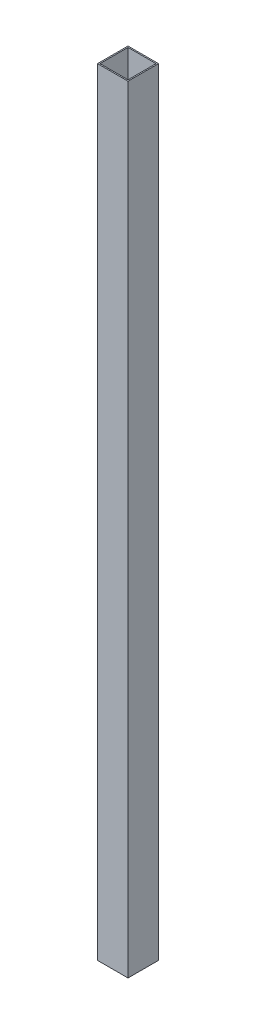
ISO-10303-21;
HEADER;
FILE_DESCRIPTION(('STEP AP214'),'2;1');
FILE_NAME('part.step','',(''),(''),'','','');
FILE_SCHEMA(('AUTOMOTIVE_DESIGN { 1 0 10303 214 1 1 1 1 }'));
ENDSEC;
DATA;
#1=APPLICATION_CONTEXT('core data for automotive mechanical design processes');
#2=APPLICATION_PROTOCOL_DEFINITION('international standard','automotive_design',2000,#1);
#3=PRODUCT_CONTEXT('',#1,'mechanical');
#4=PRODUCT('Part','Part','',(#3));
#5=PRODUCT_RELATED_PRODUCT_CATEGORY('part','',(#4));
#6=PRODUCT_DEFINITION_FORMATION('','',#4);
#7=PRODUCT_DEFINITION_CONTEXT('part definition',#1,'design');
#8=PRODUCT_DEFINITION('design','',#6,#7);
#9=PRODUCT_DEFINITION_SHAPE('','',#8);
#10=(LENGTH_UNIT() NAMED_UNIT(*) SI_UNIT(.MILLI.,.METRE.));
#11=(NAMED_UNIT(*) PLANE_ANGLE_UNIT() SI_UNIT($,.RADIAN.));
#12=(NAMED_UNIT(*) SI_UNIT($,.STERADIAN.) SOLID_ANGLE_UNIT());
#13=UNCERTAINTY_MEASURE_WITH_UNIT(LENGTH_MEASURE(1.E-05),#10,'distance_accuracy_value','');
#14=(GEOMETRIC_REPRESENTATION_CONTEXT(3) GLOBAL_UNCERTAINTY_ASSIGNED_CONTEXT((#13)) GLOBAL_UNIT_ASSIGNED_CONTEXT((#10,
#11,#12)) REPRESENTATION_CONTEXT('',''));
#15=CARTESIAN_POINT('',(0.,0.,0.));
#16=DIRECTION('',(0.,0.,1.));
#17=DIRECTION('',(1.,0.,0.));
#18=AXIS2_PLACEMENT_3D('',#15,#16,#17);
#19=CARTESIAN_POINT('',(-840.,637.,50.));
#20=DIRECTION('',(0.,-1.,0.));
#21=DIRECTION('',(0.,0.,-1.));
#22=AXIS2_PLACEMENT_3D('',#19,#20,#21);
#23=PLANE('',#22);
#24=DIRECTION('',(-1.,0.,0.));
#25=VECTOR('',#24,1.);
#26=CARTESIAN_POINT('',(-815.,637.,48.));
#27=LINE('',#26,#25);
#28=CARTESIAN_POINT('',(-792.,637.,48.));
#29=VERTEX_POINT('',#28);
#30=CARTESIAN_POINT('',(-838.,637.,48.));
#31=VERTEX_POINT('',#30);
#32=EDGE_CURVE('E120',#29,#31,#27,.T.);
#33=ORIENTED_EDGE('',*,*,#32,.T.);
#34=DIRECTION('',(0.,0.,-1.));
#35=VECTOR('',#34,1.);
#36=CARTESIAN_POINT('',(-838.,637.,25.));
#37=LINE('',#36,#35);
#38=CARTESIAN_POINT('',(-838.,637.,2.));
#39=VERTEX_POINT('',#38);
#40=EDGE_CURVE('E123',#31,#39,#37,.T.);
#41=ORIENTED_EDGE('',*,*,#40,.T.);
#42=DIRECTION('',(1.,0.,0.));
#43=VECTOR('',#42,1.);
#44=CARTESIAN_POINT('',(-815.,637.,2.));
#45=LINE('',#44,#43);
#46=CARTESIAN_POINT('',(-792.,637.,2.));
#47=VERTEX_POINT('',#46);
#48=EDGE_CURVE('E110',#39,#47,#45,.T.);
#49=ORIENTED_EDGE('',*,*,#48,.T.);
#50=DIRECTION('',(0.,0.,1.));
#51=VECTOR('',#50,1.);
#52=CARTESIAN_POINT('',(-792.,637.,25.));
#53=LINE('',#52,#51);
#54=EDGE_CURVE('E115',#47,#29,#53,.T.);
#55=ORIENTED_EDGE('',*,*,#54,.T.);
#56=EDGE_LOOP('',(#33,#41,#49,#55));
#57=FACE_BOUND('',#56,.T.);
#58=DIRECTION('',(1.,0.,0.));
#59=VECTOR('',#58,1.);
#60=CARTESIAN_POINT('',(-815.,637.,0.));
#61=LINE('',#60,#59);
#62=CARTESIAN_POINT('',(-840.,637.,0.));
#63=VERTEX_POINT('',#62);
#64=CARTESIAN_POINT('',(-790.,637.,0.));
#65=VERTEX_POINT('',#64);
#66=EDGE_CURVE('E87',#63,#65,#61,.T.);
#67=ORIENTED_EDGE('',*,*,#66,.F.);
#68=DIRECTION('',(0.,0.,1.));
#69=VECTOR('',#68,1.);
#70=CARTESIAN_POINT('',(-840.,637.,25.));
#71=LINE('',#70,#69);
#72=CARTESIAN_POINT('',(-840.,637.,50.));
#73=VERTEX_POINT('',#72);
#74=EDGE_CURVE('E20',#63,#73,#71,.T.);
#75=ORIENTED_EDGE('',*,*,#74,.T.);
#76=DIRECTION('',(1.,0.,0.));
#77=VECTOR('',#76,1.);
#78=CARTESIAN_POINT('',(-815.,637.,50.));
#79=LINE('',#78,#77);
#80=CARTESIAN_POINT('',(-790.,637.,50.));
#81=VERTEX_POINT('',#80);
#82=EDGE_CURVE('E85',#73,#81,#79,.T.);
#83=ORIENTED_EDGE('',*,*,#82,.T.);
#84=DIRECTION('',(0.,0.,1.));
#85=VECTOR('',#84,1.);
#86=CARTESIAN_POINT('',(-790.,637.,25.));
#87=LINE('',#86,#85);
#88=EDGE_CURVE('E79',#65,#81,#87,.T.);
#89=ORIENTED_EDGE('',*,*,#88,.F.);
#90=EDGE_LOOP('',(#67,#75,#83,#89));
#91=FACE_BOUND('',#90,.T.);
#92=ADVANCED_FACE('F16',(#57,#91),#23,.F.);
#93=CARTESIAN_POINT('',(-840.,-637.,50.));
#94=DIRECTION('',(1.,0.,0.));
#95=DIRECTION('',(0.,0.,-1.));
#96=AXIS2_PLACEMENT_3D('',#93,#94,#95);
#97=PLANE('',#96);
#98=DIRECTION('',(0.,0.,1.));
#99=VECTOR('',#98,1.);
#100=CARTESIAN_POINT('',(-840.,-637.,25.));
#101=LINE('',#100,#99);
#102=CARTESIAN_POINT('',(-840.,-637.,0.));
#103=VERTEX_POINT('',#102);
#104=CARTESIAN_POINT('',(-840.,-637.,50.));
#105=VERTEX_POINT('',#104);
#106=EDGE_CURVE('E101',#103,#105,#101,.T.);
#107=ORIENTED_EDGE('',*,*,#106,.T.);
#108=DIRECTION('',(0.,1.,0.));
#109=VECTOR('',#108,1.);
#110=CARTESIAN_POINT('',(-840.,0.,50.));
#111=LINE('',#110,#109);
#112=EDGE_CURVE('E92',#105,#73,#111,.T.);
#113=ORIENTED_EDGE('',*,*,#112,.T.);
#114=ORIENTED_EDGE('',*,*,#74,.F.);
#115=DIRECTION('',(0.,1.,0.));
#116=VECTOR('',#115,1.);
#117=CARTESIAN_POINT('',(-840.,0.,0.));
#118=LINE('',#117,#116);
#119=EDGE_CURVE('E105',#103,#63,#118,.T.);
#120=ORIENTED_EDGE('',*,*,#119,.F.);
#121=EDGE_LOOP('',(#107,#113,#114,#120));
#122=FACE_BOUND('',#121,.T.);
#123=ADVANCED_FACE('F100',(#122),#97,.F.);
#124=CARTESIAN_POINT('',(-790.,-637.,50.));
#125=DIRECTION('',(0.,0.,-1.));
#126=DIRECTION('',(-1.,0.,0.));
#127=AXIS2_PLACEMENT_3D('',#124,#125,#126);
#128=PLANE('',#127);
#129=DIRECTION('',(0.,-1.,0.));
#130=VECTOR('',#129,1.);
#131=CARTESIAN_POINT('',(-790.,0.,50.));
#132=LINE('',#131,#130);
#133=CARTESIAN_POINT('',(-790.,-637.,50.));
#134=VERTEX_POINT('',#133);
#135=EDGE_CURVE('E97',#81,#134,#132,.T.);
#136=ORIENTED_EDGE('',*,*,#135,.F.);
#137=ORIENTED_EDGE('',*,*,#82,.F.);
#138=ORIENTED_EDGE('',*,*,#112,.F.);
#139=DIRECTION('',(1.,0.,0.));
#140=VECTOR('',#139,1.);
#141=CARTESIAN_POINT('',(-815.,-637.,50.));
#142=LINE('',#141,#140);
#143=EDGE_CURVE('E130',#105,#134,#142,.T.);
#144=ORIENTED_EDGE('',*,*,#143,.T.);
#145=EDGE_LOOP('',(#136,#137,#138,#144));
#146=FACE_BOUND('',#145,.T.);
#147=ADVANCED_FACE('F94',(#146),#128,.F.);
#148=CARTESIAN_POINT('',(-790.,-637.,50.));
#149=DIRECTION('',(1.,0.,0.));
#150=DIRECTION('',(0.,0.,-1.));
#151=AXIS2_PLACEMENT_3D('',#148,#149,#150);
#152=PLANE('',#151);
#153=ORIENTED_EDGE('',*,*,#88,.T.);
#154=ORIENTED_EDGE('',*,*,#135,.T.);
#155=DIRECTION('',(0.,0.,-1.));
#156=VECTOR('',#155,1.);
#157=CARTESIAN_POINT('',(-790.,-637.,25.));
#158=LINE('',#157,#156);
#159=CARTESIAN_POINT('',(-790.,-637.,0.));
#160=VERTEX_POINT('',#159);
#161=EDGE_CURVE('E132',#134,#160,#158,.T.);
#162=ORIENTED_EDGE('',*,*,#161,.T.);
#163=DIRECTION('',(0.,-1.,0.));
#164=VECTOR('',#163,1.);
#165=CARTESIAN_POINT('',(-790.,0.,0.));
#166=LINE('',#165,#164);
#167=EDGE_CURVE('E108',#65,#160,#166,.T.);
#168=ORIENTED_EDGE('',*,*,#167,.F.);
#169=EDGE_LOOP('',(#153,#154,#162,#168));
#170=FACE_BOUND('',#169,.T.);
#171=ADVANCED_FACE('F174',(#170),#152,.T.);
#172=CARTESIAN_POINT('',(-790.,-637.,0.));
#173=DIRECTION('',(0.,0.,-1.));
#174=DIRECTION('',(-1.,0.,0.));
#175=AXIS2_PLACEMENT_3D('',#172,#173,#174);
#176=PLANE('',#175);
#177=ORIENTED_EDGE('',*,*,#66,.T.);
#178=ORIENTED_EDGE('',*,*,#167,.T.);
#179=DIRECTION('',(-1.,0.,0.));
#180=VECTOR('',#179,1.);
#181=CARTESIAN_POINT('',(-815.,-637.,0.));
#182=LINE('',#181,#180);
#183=EDGE_CURVE('E135',#160,#103,#182,.T.);
#184=ORIENTED_EDGE('',*,*,#183,.T.);
#185=ORIENTED_EDGE('',*,*,#119,.T.);
#186=EDGE_LOOP('',(#177,#178,#184,#185));
#187=FACE_BOUND('',#186,.T.);
#188=ADVANCED_FACE('F171',(#187),#176,.T.);
#189=CARTESIAN_POINT('',(-792.,-637.,2.));
#190=DIRECTION('',(0.,0.,-1.));
#191=DIRECTION('',(-1.,0.,0.));
#192=AXIS2_PLACEMENT_3D('',#189,#190,#191);
#193=PLANE('',#192);
#194=ORIENTED_EDGE('',*,*,#48,.F.);
#195=DIRECTION('',(0.,-1.,0.));
#196=VECTOR('',#195,1.);
#197=CARTESIAN_POINT('',(-838.,0.,2.));
#198=LINE('',#197,#196);
#199=CARTESIAN_POINT('',(-838.,-637.,2.));
#200=VERTEX_POINT('',#199);
#201=EDGE_CURVE('E126',#39,#200,#198,.T.);
#202=ORIENTED_EDGE('',*,*,#201,.T.);
#203=DIRECTION('',(1.,0.,0.));
#204=VECTOR('',#203,1.);
#205=CARTESIAN_POINT('',(-815.,-637.,2.));
#206=LINE('',#205,#204);
#207=CARTESIAN_POINT('',(-792.,-637.,2.));
#208=VERTEX_POINT('',#207);
#209=EDGE_CURVE('E138',#200,#208,#206,.T.);
#210=ORIENTED_EDGE('',*,*,#209,.T.);
#211=DIRECTION('',(0.,1.,0.));
#212=VECTOR('',#211,1.);
#213=CARTESIAN_POINT('',(-792.,0.,2.));
#214=LINE('',#213,#212);
#215=EDGE_CURVE('E112',#208,#47,#214,.T.);
#216=ORIENTED_EDGE('',*,*,#215,.T.);
#217=EDGE_LOOP('',(#194,#202,#210,#216));
#218=FACE_BOUND('',#217,.T.);
#219=ADVANCED_FACE('F156',(#218),#193,.F.);
#220=CARTESIAN_POINT('',(-792.,-637.,48.));
#221=DIRECTION('',(1.,0.,0.));
#222=DIRECTION('',(0.,0.,-1.));
#223=AXIS2_PLACEMENT_3D('',#220,#221,#222);
#224=PLANE('',#223);
#225=ORIENTED_EDGE('',*,*,#54,.F.);
#226=ORIENTED_EDGE('',*,*,#215,.F.);
#227=DIRECTION('',(0.,0.,1.));
#228=VECTOR('',#227,1.);
#229=CARTESIAN_POINT('',(-792.,-637.,25.));
#230=LINE('',#229,#228);
#231=CARTESIAN_POINT('',(-792.,-637.,48.));
#232=VERTEX_POINT('',#231);
#233=EDGE_CURVE('E141',#208,#232,#230,.T.);
#234=ORIENTED_EDGE('',*,*,#233,.T.);
#235=DIRECTION('',(0.,1.,0.));
#236=VECTOR('',#235,1.);
#237=CARTESIAN_POINT('',(-792.,0.,48.));
#238=LINE('',#237,#236);
#239=EDGE_CURVE('E117',#232,#29,#238,.T.);
#240=ORIENTED_EDGE('',*,*,#239,.T.);
#241=EDGE_LOOP('',(#225,#226,#234,#240));
#242=FACE_BOUND('',#241,.T.);
#243=ADVANCED_FACE('F154',(#242),#224,.F.);
#244=CARTESIAN_POINT('',(-838.,-637.,48.));
#245=DIRECTION('',(0.,0.,1.));
#246=DIRECTION('',(1.,0.,0.));
#247=AXIS2_PLACEMENT_3D('',#244,#245,#246);
#248=PLANE('',#247);
#249=ORIENTED_EDGE('',*,*,#32,.F.);
#250=ORIENTED_EDGE('',*,*,#239,.F.);
#251=DIRECTION('',(-1.,0.,0.));
#252=VECTOR('',#251,1.);
#253=CARTESIAN_POINT('',(-815.,-637.,48.));
#254=LINE('',#253,#252);
#255=CARTESIAN_POINT('',(-838.,-637.,48.));
#256=VERTEX_POINT('',#255);
#257=EDGE_CURVE('E26',#232,#256,#254,.T.);
#258=ORIENTED_EDGE('',*,*,#257,.T.);
#259=DIRECTION('',(0.,1.,0.));
#260=VECTOR('',#259,1.);
#261=CARTESIAN_POINT('',(-838.,0.,48.));
#262=LINE('',#261,#260);
#263=EDGE_CURVE('E34',#256,#31,#262,.T.);
#264=ORIENTED_EDGE('',*,*,#263,.T.);
#265=EDGE_LOOP('',(#249,#250,#258,#264));
#266=FACE_BOUND('',#265,.T.);
#267=ADVANCED_FACE('F148',(#266),#248,.F.);
#268=CARTESIAN_POINT('',(-838.,-637.,2.));
#269=DIRECTION('',(-1.,0.,0.));
#270=DIRECTION('',(0.,0.,1.));
#271=AXIS2_PLACEMENT_3D('',#268,#269,#270);
#272=PLANE('',#271);
#273=ORIENTED_EDGE('',*,*,#40,.F.);
#274=ORIENTED_EDGE('',*,*,#263,.F.);
#275=DIRECTION('',(0.,0.,-1.));
#276=VECTOR('',#275,1.);
#277=CARTESIAN_POINT('',(-838.,-637.,25.));
#278=LINE('',#277,#276);
#279=EDGE_CURVE('E11',#256,#200,#278,.T.);
#280=ORIENTED_EDGE('',*,*,#279,.T.);
#281=ORIENTED_EDGE('',*,*,#201,.F.);
#282=EDGE_LOOP('',(#273,#274,#280,#281));
#283=FACE_BOUND('',#282,.T.);
#284=ADVANCED_FACE('F158',(#283),#272,.F.);
#285=CARTESIAN_POINT('',(-840.,-637.,0.));
#286=DIRECTION('',(0.,1.,0.));
#287=DIRECTION('',(0.,0.,1.));
#288=AXIS2_PLACEMENT_3D('',#285,#286,#287);
#289=PLANE('',#288);
#290=ORIENTED_EDGE('',*,*,#257,.F.);
#291=ORIENTED_EDGE('',*,*,#233,.F.);
#292=ORIENTED_EDGE('',*,*,#209,.F.);
#293=ORIENTED_EDGE('',*,*,#279,.F.);
#294=EDGE_LOOP('',(#290,#291,#292,#293));
#295=FACE_BOUND('',#294,.T.);
#296=ORIENTED_EDGE('',*,*,#161,.F.);
#297=ORIENTED_EDGE('',*,*,#143,.F.);
#298=ORIENTED_EDGE('',*,*,#106,.F.);
#299=ORIENTED_EDGE('',*,*,#183,.F.);
#300=EDGE_LOOP('',(#296,#297,#298,#299));
#301=FACE_BOUND('',#300,.T.);
#302=ADVANCED_FACE('F18',(#295,#301),#289,.F.);
#303=CLOSED_SHELL('',(#92,#123,#147,#171,#188,#219,#243,#267,#284,#302));
#304=MANIFOLD_SOLID_BREP('B1',#303);
#305=ADVANCED_BREP_SHAPE_REPRESENTATION('',(#18,#304),#14);
#306=SHAPE_DEFINITION_REPRESENTATION(#9,#305);
ENDSEC;
END-ISO-10303-21;
